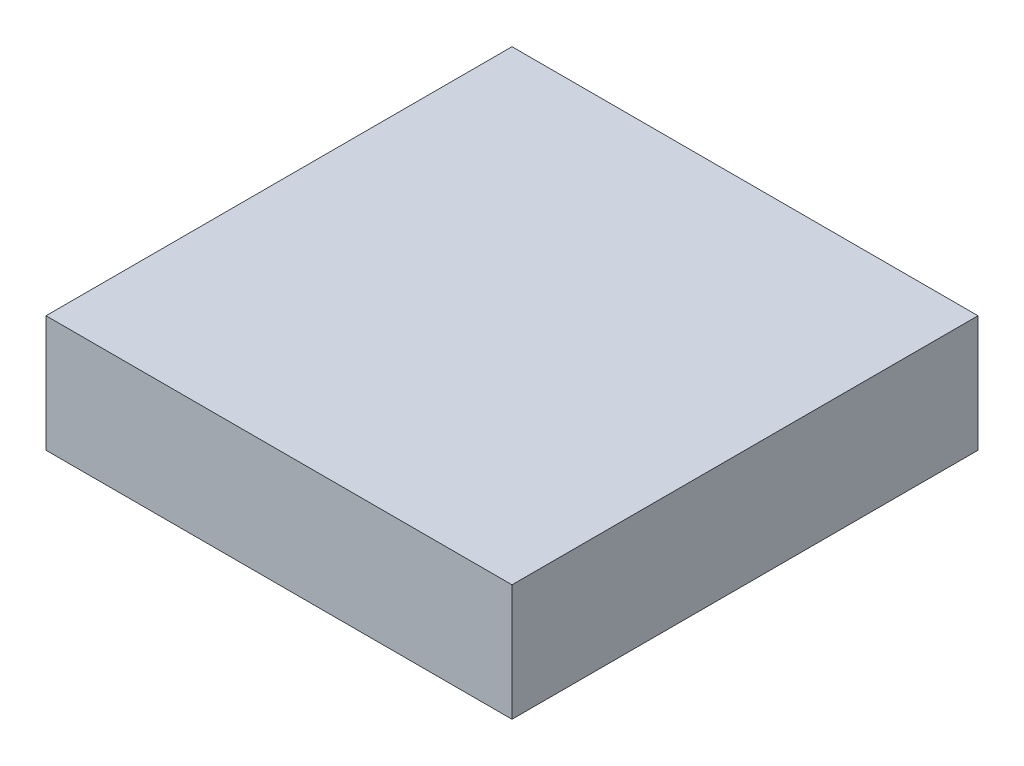
ISO-10303-21;
HEADER;
FILE_DESCRIPTION(('STEP AP214'),'2;1');
FILE_NAME('part.step','',(''),(''),'','','');
FILE_SCHEMA(('AUTOMOTIVE_DESIGN { 1 0 10303 214 1 1 1 1 }'));
ENDSEC;
DATA;
#1=APPLICATION_CONTEXT('core data for automotive mechanical design processes');
#2=APPLICATION_PROTOCOL_DEFINITION('international standard','automotive_design',2000,#1);
#3=PRODUCT_CONTEXT('',#1,'mechanical');
#4=PRODUCT('Part','Part','',(#3));
#5=PRODUCT_RELATED_PRODUCT_CATEGORY('part','',(#4));
#6=PRODUCT_DEFINITION_FORMATION('','',#4);
#7=PRODUCT_DEFINITION_CONTEXT('part definition',#1,'design');
#8=PRODUCT_DEFINITION('design','',#6,#7);
#9=PRODUCT_DEFINITION_SHAPE('','',#8);
#10=(LENGTH_UNIT() NAMED_UNIT(*) SI_UNIT(.MILLI.,.METRE.));
#11=(NAMED_UNIT(*) PLANE_ANGLE_UNIT() SI_UNIT($,.RADIAN.));
#12=(NAMED_UNIT(*) SI_UNIT($,.STERADIAN.) SOLID_ANGLE_UNIT());
#13=UNCERTAINTY_MEASURE_WITH_UNIT(LENGTH_MEASURE(1.E-05),#10,'distance_accuracy_value','');
#14=(GEOMETRIC_REPRESENTATION_CONTEXT(3) GLOBAL_UNCERTAINTY_ASSIGNED_CONTEXT((#13)) GLOBAL_UNIT_ASSIGNED_CONTEXT((#10,
#11,#12)) REPRESENTATION_CONTEXT('',''));
#15=CARTESIAN_POINT('',(0.,0.,0.));
#16=DIRECTION('',(0.,0.,1.));
#17=DIRECTION('',(1.,0.,0.));
#18=AXIS2_PLACEMENT_3D('',#15,#16,#17);
#19=CARTESIAN_POINT('',(-101.6,50.8,-101.6));
#20=DIRECTION('',(0.,0.,-1.));
#21=DIRECTION('',(-1.,0.,0.));
#22=AXIS2_PLACEMENT_3D('',#19,#20,#21);
#23=PLANE('',#22);
#24=DIRECTION('',(1.,0.,0.));
#25=VECTOR('',#24,1.);
#26=CARTESIAN_POINT('',(-101.6,0.,-101.6));
#27=LINE('',#26,#25);
#28=CARTESIAN_POINT('',(-101.6,0.,-101.6));
#29=VERTEX_POINT('',#28);
#30=CARTESIAN_POINT('',(101.6,0.,-101.6));
#31=VERTEX_POINT('',#30);
#32=EDGE_CURVE('E110',#29,#31,#27,.T.);
#33=ORIENTED_EDGE('',*,*,#32,.F.);
#34=DIRECTION('',(0.,-1.,0.));
#35=VECTOR('',#34,1.);
#36=CARTESIAN_POINT('',(-101.6,50.8,-101.6));
#37=LINE('',#36,#35);
#38=CARTESIAN_POINT('',(-101.6,50.8,-101.6));
#39=VERTEX_POINT('',#38);
#40=EDGE_CURVE('E11',#39,#29,#37,.T.);
#41=ORIENTED_EDGE('',*,*,#40,.F.);
#42=DIRECTION('',(1.,0.,0.));
#43=VECTOR('',#42,1.);
#44=CARTESIAN_POINT('',(-101.6,50.8,-101.6));
#45=LINE('',#44,#43);
#46=CARTESIAN_POINT('',(101.6,50.8,-101.6));
#47=VERTEX_POINT('',#46);
#48=EDGE_CURVE('E103',#39,#47,#45,.T.);
#49=ORIENTED_EDGE('',*,*,#48,.T.);
#50=DIRECTION('',(0.,-1.,0.));
#51=VECTOR('',#50,1.);
#52=CARTESIAN_POINT('',(101.6,50.8,-101.6));
#53=LINE('',#52,#51);
#54=EDGE_CURVE('E42',#47,#31,#53,.T.);
#55=ORIENTED_EDGE('',*,*,#54,.T.);
#56=EDGE_LOOP('',(#33,#41,#49,#55));
#57=FACE_BOUND('',#56,.T.);
#58=ADVANCED_FACE('F39',(#57),#23,.T.);
#59=CARTESIAN_POINT('',(-101.6,50.8,-101.6));
#60=DIRECTION('',(1.,0.,0.));
#61=DIRECTION('',(0.,0.,-1.));
#62=AXIS2_PLACEMENT_3D('',#59,#60,#61);
#63=PLANE('',#62);
#64=DIRECTION('',(0.,0.,1.));
#65=VECTOR('',#64,1.);
#66=CARTESIAN_POINT('',(-101.6,0.,-101.6));
#67=LINE('',#66,#65);
#68=CARTESIAN_POINT('',(-101.6,0.,101.6));
#69=VERTEX_POINT('',#68);
#70=EDGE_CURVE('E73',#29,#69,#67,.T.);
#71=ORIENTED_EDGE('',*,*,#70,.T.);
#72=DIRECTION('',(0.,-1.,0.));
#73=VECTOR('',#72,1.);
#74=CARTESIAN_POINT('',(-101.6,50.8,101.6));
#75=LINE('',#74,#73);
#76=CARTESIAN_POINT('',(-101.6,50.8,101.6));
#77=VERTEX_POINT('',#76);
#78=EDGE_CURVE('E49',#77,#69,#75,.T.);
#79=ORIENTED_EDGE('',*,*,#78,.F.);
#80=DIRECTION('',(0.,0.,1.));
#81=VECTOR('',#80,1.);
#82=CARTESIAN_POINT('',(-101.6,50.8,-101.6));
#83=LINE('',#82,#81);
#84=EDGE_CURVE('E90',#39,#77,#83,.T.);
#85=ORIENTED_EDGE('',*,*,#84,.F.);
#86=ORIENTED_EDGE('',*,*,#40,.T.);
#87=EDGE_LOOP('',(#71,#79,#85,#86));
#88=FACE_BOUND('',#87,.T.);
#89=ADVANCED_FACE('F126',(#88),#63,.F.);
#90=CARTESIAN_POINT('',(-101.6,50.8,101.6));
#91=DIRECTION('',(0.,0.,-1.));
#92=DIRECTION('',(-1.,0.,0.));
#93=AXIS2_PLACEMENT_3D('',#90,#91,#92);
#94=PLANE('',#93);
#95=DIRECTION('',(1.,0.,0.));
#96=VECTOR('',#95,1.);
#97=CARTESIAN_POINT('',(-101.6,0.,101.6));
#98=LINE('',#97,#96);
#99=CARTESIAN_POINT('',(101.6,0.,101.6));
#100=VERTEX_POINT('',#99);
#101=EDGE_CURVE('E98',#69,#100,#98,.T.);
#102=ORIENTED_EDGE('',*,*,#101,.T.);
#103=DIRECTION('',(0.,-1.,0.));
#104=VECTOR('',#103,1.);
#105=CARTESIAN_POINT('',(101.6,50.8,101.6));
#106=LINE('',#105,#104);
#107=CARTESIAN_POINT('',(101.6,50.8,101.6));
#108=VERTEX_POINT('',#107);
#109=EDGE_CURVE('E95',#108,#100,#106,.T.);
#110=ORIENTED_EDGE('',*,*,#109,.F.);
#111=DIRECTION('',(1.,0.,0.));
#112=VECTOR('',#111,1.);
#113=CARTESIAN_POINT('',(-101.6,50.8,101.6));
#114=LINE('',#113,#112);
#115=EDGE_CURVE('E85',#77,#108,#114,.T.);
#116=ORIENTED_EDGE('',*,*,#115,.F.);
#117=ORIENTED_EDGE('',*,*,#78,.T.);
#118=EDGE_LOOP('',(#102,#110,#116,#117));
#119=FACE_BOUND('',#118,.T.);
#120=ADVANCED_FACE('F96',(#119),#94,.F.);
#121=CARTESIAN_POINT('',(101.6,50.8,-101.6));
#122=DIRECTION('',(1.,0.,0.));
#123=DIRECTION('',(0.,0.,-1.));
#124=AXIS2_PLACEMENT_3D('',#121,#122,#123);
#125=PLANE('',#124);
#126=DIRECTION('',(0.,0.,1.));
#127=VECTOR('',#126,1.);
#128=CARTESIAN_POINT('',(101.6,0.,-101.6));
#129=LINE('',#128,#127);
#130=EDGE_CURVE('E114',#31,#100,#129,.T.);
#131=ORIENTED_EDGE('',*,*,#130,.F.);
#132=ORIENTED_EDGE('',*,*,#54,.F.);
#133=DIRECTION('',(0.,0.,1.));
#134=VECTOR('',#133,1.);
#135=CARTESIAN_POINT('',(101.6,50.8,-101.6));
#136=LINE('',#135,#134);
#137=EDGE_CURVE('E89',#47,#108,#136,.T.);
#138=ORIENTED_EDGE('',*,*,#137,.T.);
#139=ORIENTED_EDGE('',*,*,#109,.T.);
#140=EDGE_LOOP('',(#131,#132,#138,#139));
#141=FACE_BOUND('',#140,.T.);
#142=ADVANCED_FACE('F101',(#141),#125,.T.);
#143=CARTESIAN_POINT('',(0.,50.8,0.));
#144=DIRECTION('',(0.,-1.,0.));
#145=DIRECTION('',(0.,0.,-1.));
#146=AXIS2_PLACEMENT_3D('',#143,#144,#145);
#147=PLANE('',#146);
#148=ORIENTED_EDGE('',*,*,#48,.F.);
#149=ORIENTED_EDGE('',*,*,#84,.T.);
#150=ORIENTED_EDGE('',*,*,#115,.T.);
#151=ORIENTED_EDGE('',*,*,#137,.F.);
#152=EDGE_LOOP('',(#148,#149,#150,#151));
#153=FACE_BOUND('',#152,.T.);
#154=ADVANCED_FACE('F88',(#153),#147,.F.);
#155=CARTESIAN_POINT('',(0.,0.,0.));
#156=DIRECTION('',(0.,-1.,0.));
#157=DIRECTION('',(0.,0.,-1.));
#158=AXIS2_PLACEMENT_3D('',#155,#156,#157);
#159=PLANE('',#158);
#160=ORIENTED_EDGE('',*,*,#32,.T.);
#161=ORIENTED_EDGE('',*,*,#130,.T.);
#162=ORIENTED_EDGE('',*,*,#101,.F.);
#163=ORIENTED_EDGE('',*,*,#70,.F.);
#164=EDGE_LOOP('',(#160,#161,#162,#163));
#165=FACE_BOUND('',#164,.T.);
#166=ADVANCED_FACE('F123',(#165),#159,.T.);
#167=CLOSED_SHELL('',(#58,#89,#120,#142,#154,#166));
#168=MANIFOLD_SOLID_BREP('B2',#167);
#169=ADVANCED_BREP_SHAPE_REPRESENTATION('',(#18,#168),#14);
#170=SHAPE_DEFINITION_REPRESENTATION(#9,#169);
ENDSEC;
END-ISO-10303-21;
